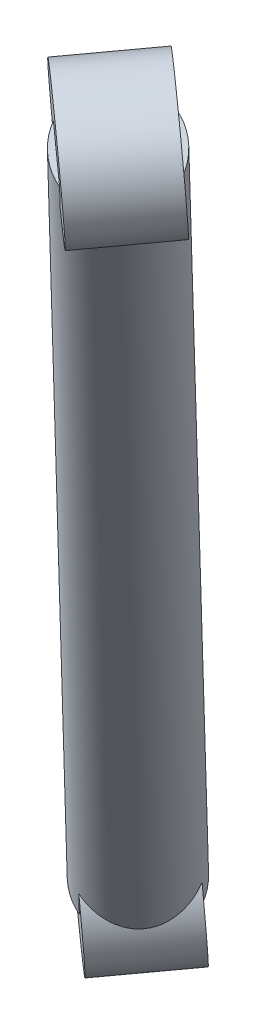
ISO-10303-21;
HEADER;
FILE_DESCRIPTION(('STEP AP214'),'2;1');
FILE_NAME('part.step','',(''),(''),'','','');
FILE_SCHEMA(('AUTOMOTIVE_DESIGN { 1 0 10303 214 1 1 1 1 }'));
ENDSEC;
DATA;
#1=APPLICATION_CONTEXT('core data for automotive mechanical design processes');
#2=APPLICATION_PROTOCOL_DEFINITION('international standard','automotive_design',2000,#1);
#3=PRODUCT_CONTEXT('',#1,'mechanical');
#4=PRODUCT('Part','Part','',(#3));
#5=PRODUCT_RELATED_PRODUCT_CATEGORY('part','',(#4));
#6=PRODUCT_DEFINITION_FORMATION('','',#4);
#7=PRODUCT_DEFINITION_CONTEXT('part definition',#1,'design');
#8=PRODUCT_DEFINITION('design','',#6,#7);
#9=PRODUCT_DEFINITION_SHAPE('','',#8);
#10=(LENGTH_UNIT() NAMED_UNIT(*) SI_UNIT(.MILLI.,.METRE.));
#11=(NAMED_UNIT(*) PLANE_ANGLE_UNIT() SI_UNIT($,.RADIAN.));
#12=(NAMED_UNIT(*) SI_UNIT($,.STERADIAN.) SOLID_ANGLE_UNIT());
#13=UNCERTAINTY_MEASURE_WITH_UNIT(LENGTH_MEASURE(1.E-05),#10,'distance_accuracy_value','');
#14=(GEOMETRIC_REPRESENTATION_CONTEXT(3) GLOBAL_UNCERTAINTY_ASSIGNED_CONTEXT((#13)) GLOBAL_UNIT_ASSIGNED_CONTEXT((#10,
#11,#12)) REPRESENTATION_CONTEXT('',''));
#15=CARTESIAN_POINT('',(0.,0.,0.));
#16=DIRECTION('',(0.,0.,1.));
#17=DIRECTION('',(1.,0.,0.));
#18=AXIS2_PLACEMENT_3D('',#15,#16,#17);
#19=CARTESIAN_POINT('',(503.54,1408.46,-83.29));
#20=DIRECTION('',(-0.463004376310124,-0.750306246149666,-0.47187655642813));
#21=DIRECTION('',(0.,0.532378141285444,-0.846506653654569));
#22=AXIS2_PLACEMENT_3D('',#19,#20,#21);
#23=CYLINDRICAL_SURFACE('',#22,7.99999999999995);
#24=CARTESIAN_POINT('',(501.092381544247,1403.73431411944,-95.1928170826298));
#25=CARTESIAN_POINT('',(500.926722161895,1403.92560452981,-95.1659029267145));
#26=CARTESIAN_POINT('',(500.761645688265,1404.11553220438,-95.1269638063124));
#27=CARTESIAN_POINT('',(500.432986995004,1404.49048769267,-95.0268332204544));
#28=CARTESIAN_POINT('',(500.269403625234,1404.67551953137,-94.9656606845747));
#29=CARTESIAN_POINT('',(499.943252009725,1405.03942709947,-94.822578618301));
#30=CARTESIAN_POINT('',(499.780688744562,1405.21828103168,-94.7406027939662));
#31=CARTESIAN_POINT('',(499.456864030324,1405.56729473088,-94.5576420583964));
#32=CARTESIAN_POINT('',(499.295602878749,1405.73745255584,-94.4566529244819));
#33=CARTESIAN_POINT('',(498.974409991023,1406.06651981513,-94.2374967253778));
#34=CARTESIAN_POINT('',(498.81447580295,1406.22545926307,-94.1193782954337));
#35=CARTESIAN_POINT('',(498.494795401074,1406.53033851225,-93.8671332232649));
#36=CARTESIAN_POINT('',(498.335049203294,1406.67627727475,-93.7330053039081));
#37=CARTESIAN_POINT('',(498.015133967541,1406.95224261934,-93.4502716062872));
#38=CARTESIAN_POINT('',(497.854965907378,1407.08229246804,-93.3016875838895));
#39=CARTESIAN_POINT('',(497.533224221479,1407.32338617471,-92.991434437252));
#40=CARTESIAN_POINT('',(497.371651285909,1407.43443886599,-92.8297714462599));
#41=CARTESIAN_POINT('',(496.987358998286,1407.66968526858,-92.4343831877809));
#42=CARTESIAN_POINT('',(496.763572730037,1407.78421012584,-92.1956717978335));
#43=CARTESIAN_POINT('',(496.424893892101,1407.91575536774,-91.8266637731422));
#44=CARTESIAN_POINT('',(496.311559255731,1407.95288812938,-91.7019036251233));
#45=CARTESIAN_POINT('',(496.084094101302,1408.01253361291,-91.4496824654047));
#46=CARTESIAN_POINT('',(495.969964018338,1408.03505377685,-91.3222228627185));
#47=CARTESIAN_POINT('',(495.740446942433,1408.06458574232,-91.0646431843398));
#48=CARTESIAN_POINT('',(495.625057552103,1408.07146316406,-90.9345096750827));
#49=CARTESIAN_POINT('',(495.394825738504,1408.0687472199,-90.6739211220134));
#50=CARTESIAN_POINT('',(495.279983304166,1408.0591541888,-90.5434660847909));
#51=CARTESIAN_POINT('',(495.05183501675,1408.02353019966,-90.2833892422512));
#52=CARTESIAN_POINT('',(494.938529705962,1407.99749358695,-90.1537677390692));
#53=CARTESIAN_POINT('',(494.714593397385,1407.92962913551,-89.8963822819624));
#54=CARTESIAN_POINT('',(494.603962422511,1407.88780116152,-89.7686183439585));
#55=CARTESIAN_POINT('',(494.397249712204,1407.79438497922,-89.5282074043766));
#56=CARTESIAN_POINT('',(494.300815331237,1407.74418136612,-89.4153207890385));
#57=CARTESIAN_POINT('',(494.111611343961,1407.63291720528,-89.1918234466123));
#58=CARTESIAN_POINT('',(494.018843070073,1407.57185275381,-89.0812135538554));
#59=CARTESIAN_POINT('',(493.746823164248,1407.37393472031,-88.7528174279853));
#60=CARTESIAN_POINT('',(493.573896952769,1407.22237541135,-88.5385113823091));
#61=CARTESIAN_POINT('',(493.283246339254,1406.92418883553,-88.1632424098674));
#62=CARTESIAN_POINT('',(493.161592144215,1406.78333091397,-88.0006045728299));
#63=CARTESIAN_POINT('',(492.932198989008,1406.48601657667,-87.6796497491821));
#64=CARTESIAN_POINT('',(492.82446636089,1406.32955311987,-87.5213347544016));
#65=CARTESIAN_POINT('',(492.62398204053,1406.00374614717,-87.2079799545906));
#66=CARTESIAN_POINT('',(492.53125354662,1405.83438327054,-87.052945537415));
#67=CARTESIAN_POINT('',(492.362084002123,1405.4854137624,-86.7455860804363));
#68=CARTESIAN_POINT('',(492.285641425253,1405.30580809282,-86.5932607879668));
#69=CARTESIAN_POINT('',(492.151491022501,1404.94190001874,-86.2935392779423));
#70=CARTESIAN_POINT('',(492.093457720835,1404.75774959513,-86.1461042457897));
#71=CARTESIAN_POINT('',(491.995416619475,1404.38346545752,-85.8529070223298));
#72=CARTESIAN_POINT('',(491.955405012855,1404.19333301626,-85.7071444840688));
#73=CARTESIAN_POINT('',(491.894761810267,1403.80932033464,-85.4174874165499));
#74=CARTESIAN_POINT('',(491.874081906469,1403.61545067853,-85.2735891218826));
#75=CARTESIAN_POINT('',(491.853246602271,1403.22524120921,-84.9873736964167));
#76=CARTESIAN_POINT('',(491.8531072078,1403.0288995889,-84.8450578850889));
#77=CARTESIAN_POINT('',(491.863914324977,1402.83234435317,-84.7036876880862));
#78=B_SPLINE_CURVE_WITH_KNOTS('',3,(#24,#25,#26,#27,#28,#29,#30,#31,#32,#33,#34,#35,#36,#37,#38,
#39,#40,#41,#42,#43,#44,#45,#46,#47,#48,#49,#50,#51,#52,#53,#54,#55,#56,#57,#58,#59,#60,#61,#62,
#63,#64,#65,#66,#67,#68,#69,#70,#71,#72,#73,#74,#75,#76,#77),.UNSPECIFIED.,.F.,.F.,(4,2,2,2,2,2,
2,2,2,2,2,2,2,2,2,2,2,2,2,2,2,2,2,2,2,2,4),(0.,0.762958906264792,1.5252697435942,
2.29004103323236,3.05498237225959,3.81779285757185,4.58066423562392,5.34240477719372,
6.10379015616985,7.13935621584758,7.65661504598396,8.17361023455535,8.69503018868906,
9.21643954399904,9.73802830137123,10.2596215265594,10.7293351342428,11.1992179147805,
12.1391755457859,12.8798105708365,13.6207812874998,14.3628869141442,15.1049229615161,
15.8329956148147,16.5609143969505,17.2870092879693,18.0136699761485),.UNSPECIFIED.);
#79=CARTESIAN_POINT('',(501.092381544247,1403.73431411944,-95.1928170826298));
#80=VERTEX_POINT('',#79);
#81=CARTESIAN_POINT('',(491.863914324977,1402.83234435317,-84.7036876880862));
#82=VERTEX_POINT('',#81);
#83=EDGE_CURVE('E235',#80,#82,#78,.T.);
#84=ORIENTED_EDGE('',*,*,#83,.F.);
#85=CARTESIAN_POINT('',(500.476936742047,1402.73681289455,-95.8201244470991));
#86=CARTESIAN_POINT('',(501.609324016441,1404.57216464494,-94.6659106585216));
#87=CARTESIAN_POINT('',(502.741711296524,1406.40751638902,-93.5116968654828));
#88=CARTESIAN_POINT('',(505.006485868069,1410.07821986454,-91.2032692704824));
#89=CARTESIAN_POINT('',(506.138873159531,1411.91357159598,-90.0490554685208));
#90=CARTESIAN_POINT('',(507.271260456682,1413.74892332111,-88.8948416620978));
#91=B_SPLINE_CURVE_WITH_KNOTS('',3,(#85,#86,#87,#88,#89,#90),.UNSPECIFIED.,.F.,.F.,(4,2,4),(0.,
7.33806773678093,14.676135473562),.UNSPECIFIED.);
#92=CARTESIAN_POINT('',(505.85874823777,1411.45955045955,-90.3345797355441));
#93=VERTEX_POINT('',#92);
#94=EDGE_CURVE('E145',#80,#93,#91,.T.);
#95=ORIENTED_EDGE('',*,*,#94,.T.);
#96=CARTESIAN_POINT('',(503.54,1408.46,-83.29));
#97=DIRECTION('',(-0.463004376310124,-0.750306246149666,-0.471876556428131));
#98=DIRECTION('',(0.,0.532378141285444,-0.846506653654569));
#99=AXIS2_PLACEMENT_3D('',#96,#97,#98);
#100=CIRCLE('',#99,7.99999999999995);
#101=CARTESIAN_POINT('',(510.449031802631,1406.36318224794,-86.735088513358));
#102=VERTEX_POINT('',#101);
#103=EDGE_CURVE('E133',#93,#102,#100,.T.);
#104=ORIENTED_EDGE('',*,*,#103,.T.);
#105=CARTESIAN_POINT('',(510.631047949373,1406.65811889125,-86.5495702153981));
#106=CARTESIAN_POINT('',(509.733743856513,1405.20413877994,-87.464139230562));
#107=CARTESIAN_POINT('',(508.836439760081,1403.75015867259,-88.3787082485261));
#108=CARTESIAN_POINT('',(507.041831560076,1400.84219846582,-90.2078462900548));
#109=CARTESIAN_POINT('',(506.144527456502,1399.38821836641,-91.1224153136194));
#110=CARTESIAN_POINT('',(505.247223349357,1397.93423827095,-92.0369843399844));
#111=B_SPLINE_CURVE_WITH_KNOTS('',3,(#105,#106,#107,#108,#109,#110),.UNSPECIFIED.,.F.,.F.,(4,2,
4),(0.,5.81384928802945,11.6276985760588),.UNSPECIFIED.);
#112=CARTESIAN_POINT('',(505.681977863056,1398.63870892363,-91.5938647674841));
#113=VERTEX_POINT('',#112);
#114=EDGE_CURVE('E241',#102,#113,#111,.T.);
#115=ORIENTED_EDGE('',*,*,#114,.T.);
#116=CARTESIAN_POINT('',(496.454885001525,1397.73521327492,-81.1036576642229));
#117=CARTESIAN_POINT('',(496.694218429472,1397.66329275144,-81.0555401041613));
#118=CARTESIAN_POINT('',(496.93752445823,1397.60012107376,-81.0148035451266));
#119=CARTESIAN_POINT('',(497.429598133899,1397.48995612207,-80.9484916849258));
#120=CARTESIAN_POINT('',(497.678360968739,1397.44294915873,-80.9229035417749));
#121=CARTESIAN_POINT('',(498.180090246445,1397.36354845983,-80.8871469892286));
#122=CARTESIAN_POINT('',(498.433067697512,1397.33120256415,-80.8770288079289));
#123=CARTESIAN_POINT('',(498.940540907341,1397.27978015917,-80.8729267251875));
#124=CARTESIAN_POINT('',(499.195036991056,1397.26070660063,-80.8789464101503));
#125=CARTESIAN_POINT('',(499.70295745764,1397.23422901296,-80.907901643129));
#126=CARTESIAN_POINT('',(499.956382851987,1397.22679265626,-80.9307900691646));
#127=CARTESIAN_POINT('',(500.461085147552,1397.22174716498,-80.9945739241513));
#128=CARTESIAN_POINT('',(500.71236187528,1397.22413881657,-81.0354707934248));
#129=CARTESIAN_POINT('',(501.210421248856,1397.23687376489,-81.1367528619069));
#130=CARTESIAN_POINT('',(501.457210024001,1397.24720522753,-81.1971089799538));
#131=CARTESIAN_POINT('',(501.944096602942,1397.27376042056,-81.3391583885887));
#132=CARTESIAN_POINT('',(502.184197476489,1397.28998139803,-81.4208417052305));
#133=CARTESIAN_POINT('',(502.73986845953,1397.33261918934,-81.6415915800772));
#134=CARTESIAN_POINT('',(503.051509133727,1397.36060455012,-81.7907302190088));
#135=CARTESIAN_POINT('',(503.49749905277,1397.40317231654,-82.0503057380667));
#136=CARTESIAN_POINT('',(503.642515772594,1397.41745247255,-82.1427529098801));
#137=CARTESIAN_POINT('',(503.924024765111,1397.44552980904,-82.3398422572722));
#138=CARTESIAN_POINT('',(504.060521343713,1397.45932723192,-82.4444781949853));
#139=CARTESIAN_POINT('',(504.324617686557,1397.48597887124,-82.6667511936401));
#140=CARTESIAN_POINT('',(504.452131415117,1397.49882401572,-82.7844917547321));
#141=CARTESIAN_POINT('',(504.695543908737,1397.52304787385,-83.0315697565457));
#142=CARTESIAN_POINT('',(504.811442908953,1397.53442661719,-83.1609069623757));
#143=CARTESIAN_POINT('',(505.030580423618,1397.55559239371,-83.4300818989983));
#144=CARTESIAN_POINT('',(505.133814546433,1397.56537887515,-83.569923245226));
#145=CARTESIAN_POINT('',(505.326975162902,1397.58350719594,-83.8585832154644));
#146=CARTESIAN_POINT('',(505.416901541146,1397.59184902276,-84.0074019173151));
#147=CARTESIAN_POINT('',(505.575075987204,1397.60670992016,-84.2972262819082));
#148=CARTESIAN_POINT('',(505.644590067601,1397.61332773916,-84.4375399296497));
#149=CARTESIAN_POINT('',(505.772987301721,1397.62613192298,-84.7229892672835));
#150=CARTESIAN_POINT('',(505.8318666174,1397.63231813153,-84.8681266757668));
#151=CARTESIAN_POINT('',(505.993184338899,1397.65095967916,-85.3093118446709));
#152=CARTESIAN_POINT('',(506.080272203239,1397.66349544636,-85.6110756022032));
#153=CARTESIAN_POINT('',(506.203045935756,1397.68977062221,-86.1574086022235));
#154=CARTESIAN_POINT('',(506.245715051785,1397.70269140558,-86.4005401147969));
#155=CARTESIAN_POINT('',(506.310377660375,1397.73318089802,-86.8893685331448));
#156=CARTESIAN_POINT('',(506.332361773274,1397.75075171104,-87.1350665516985));
#157=CARTESIAN_POINT('',(506.357391025022,1397.79236462857,-87.6272169529933));
#158=CARTESIAN_POINT('',(506.360407133911,1397.81641659366,-87.8736699147574));
#159=CARTESIAN_POINT('',(506.348832773637,1397.872632302,-88.3652064136952));
#160=CARTESIAN_POINT('',(506.334243956193,1397.90479528404,-88.6102900771713));
#161=CARTESIAN_POINT('',(506.288948537451,1397.97805565622,-89.0928327373697));
#162=CARTESIAN_POINT('',(506.258552185858,1398.01897244603,-89.3303482532556));
#163=CARTESIAN_POINT('',(506.182575939778,1398.11139334785,-89.8008085501176));
#164=CARTESIAN_POINT('',(506.136999258134,1398.16289521869,-90.0337542872281));
#165=CARTESIAN_POINT('',(506.03135603539,1398.27757046408,-90.4927929779347));
#166=CARTESIAN_POINT('',(505.971326009764,1398.34071433313,-90.7189016098869));
#167=CARTESIAN_POINT('',(505.837135338282,1398.47983213611,-91.1630188813855));
#168=CARTESIAN_POINT('',(505.7629637109,1398.55581603559,-91.3810210676833));
#169=CARTESIAN_POINT('',(505.681977863056,1398.63870892363,-91.5938647674841));
#170=B_SPLINE_CURVE_WITH_KNOTS('',3,(#116,#117,#118,#119,#120,#121,#122,#123,#124,#125,#126,
#127,#128,#129,#130,#131,#132,#133,#134,#135,#136,#137,#138,#139,#140,#141,#142,#143,#144,#145,
#146,#147,#148,#149,#150,#151,#152,#153,#154,#155,#156,#157,#158,#159,#160,#161,#162,#163,#164,
#165,#166,#167,#168,#169),.UNSPECIFIED.,.F.,.F.,(4,2,2,2,2,2,2,2,2,2,2,2,2,2,2,2,2,2,2,2,2,2,2,
2,2,2,4),(0.,0.763011542653548,1.52537531682672,2.2902091273305,3.05521292503414,
3.81808778439772,4.58102366988173,5.34282461898604,6.10426993796247,7.13968921486055,
7.65687484935751,8.17379695619204,8.69513827194005,9.2164690302268,9.73798005564087,
10.259495603565,10.7292144777064,11.1991025342617,12.1390705688162,12.8797587803774,
13.6207826970848,14.3629404532261,15.1050285845167,15.8330728947372,16.5609632156687,
17.2870335154304,18.0136699515927),.UNSPECIFIED.);
#171=CARTESIAN_POINT('',(496.454885001525,1397.73521327492,-81.1036576642229));
#172=VERTEX_POINT('',#171);
#173=EDGE_CURVE('E213',#172,#113,#170,.T.);
#174=ORIENTED_EDGE('',*,*,#173,.F.);
#175=CARTESIAN_POINT('',(501.230020040586,1405.47466099881,-76.2364829795065));
#176=CARTESIAN_POINT('',(500.361767520143,1404.06741387008,-77.1214708719438));
#177=CARTESIAN_POINT('',(499.493514996357,1402.66016674506,-78.0064587670028));
#178=CARTESIAN_POINT('',(497.757009942098,1399.84567250244,-79.7764345623642));
#179=CARTESIAN_POINT('',(496.888757411625,1398.43842538484,-80.6614224626666));
#180=CARTESIAN_POINT('',(496.020504877808,1397.03117827095,-81.5464103655907));
#181=B_SPLINE_CURVE_WITH_KNOTS('',3,(#175,#176,#177,#178,#179,#180),.UNSPECIFIED.,.F.,.F.,(4,2,
4),(0.,5.62642821095905,11.2528564219182),.UNSPECIFIED.);
#182=CARTESIAN_POINT('',(501.22125176223,1405.46044954045,-76.2454202644559));
#183=VERTEX_POINT('',#182);
#184=EDGE_CURVE('E220',#183,#172,#181,.T.);
#185=ORIENTED_EDGE('',*,*,#184,.F.);
#186=CARTESIAN_POINT('',(496.63096819737,1410.55681775206,-79.8449114866413));
#187=VERTEX_POINT('',#186);
#188=EDGE_CURVE('E209',#183,#187,#100,.T.);
#189=ORIENTED_EDGE('',*,*,#188,.T.);
#190=CARTESIAN_POINT('',(491.248775776375,1401.83558166783,-85.3306620470991));
#191=CARTESIAN_POINT('',(492.474135273463,1403.82113862483,-84.0817255479095));
#192=CARTESIAN_POINT('',(493.699494777207,1405.80669557443,-82.8327890434997));
#193=CARTESIAN_POINT('',(496.15021379801,1409.77780945886,-80.33491602424));
#194=CARTESIAN_POINT('',(497.375573315068,1411.76336639368,-79.0859795093901));
#195=CARTESIAN_POINT('',(498.600932838784,1413.74892332111,-77.83704298932));
#196=B_SPLINE_CURVE_WITH_KNOTS('',3,(#190,#191,#192,#193,#194,#195),.UNSPECIFIED.,.F.,.F.,(4,2,
4),(0.,7.93939936961963,15.8787987392393),.UNSPECIFIED.);
#197=EDGE_CURVE('E148',#82,#187,#196,.T.);
#198=ORIENTED_EDGE('',*,*,#197,.F.);
#199=EDGE_LOOP('',(#84,#95,#104,#115,#174,#185,#189,#198));
#200=FACE_BOUND('',#199,.T.);
#201=CARTESIAN_POINT('',(350.234985767874,1146.73305514412,-250.018811819599));
#202=CARTESIAN_POINT('',(350.24633386157,1146.52665615624,-249.870356328116));
#203=CARTESIAN_POINT('',(350.245612122436,1146.32049828583,-249.720869316441));
#204=CARTESIAN_POINT('',(350.221577078848,1145.91102268936,-249.420166559963));
#205=CARTESIAN_POINT('',(350.19828295431,1145.70770270071,-249.268952390532));
#206=CARTESIAN_POINT('',(350.130555733194,1145.3052520062,-248.964384258158));
#207=CARTESIAN_POINT('',(350.086054391371,1145.10613700786,-248.811024949699));
#208=CARTESIAN_POINT('',(349.977366374213,1144.71480759099,-248.502417806906));
#209=CARTESIAN_POINT('',(349.913175325937,1144.52259471598,-248.347169560417));
#210=CARTESIAN_POINT('',(349.766695889233,1144.14778189137,-248.034788692497));
#211=CARTESIAN_POINT('',(349.68445836122,1143.96515667847,-247.877662517447));
#212=CARTESIAN_POINT('',(349.503042130378,1143.61127336211,-247.560372411709));
#213=CARTESIAN_POINT('',(349.403862072865,1143.44001616912,-247.40020823902));
#214=CARTESIAN_POINT('',(349.189905643028,1143.11185553146,-247.076145537334));
#215=CARTESIAN_POINT('',(349.075152691153,1142.95493111322,-246.912252917972));
#216=CARTESIAN_POINT('',(348.831291987601,1142.65855610863,-246.579633641012));
#217=CARTESIAN_POINT('',(348.702190962159,1142.51909739918,-246.410909275798));
#218=CARTESIAN_POINT('',(348.381971202228,1142.21504961157,-246.005529257631));
#219=CARTESIAN_POINT('',(348.185251639975,1142.0594729749,-245.766274724977));
#220=CARTESIAN_POINT('',(347.876348888356,1141.86470406537,-245.399201710553));
#221=CARTESIAN_POINT('',(347.771134227042,1141.80623364401,-245.275543584022));
#222=CARTESIAN_POINT('',(347.556902298987,1141.70346190432,-245.025698642491));
#223=CARTESIAN_POINT('',(347.44788699715,1141.65915338143,-244.899513148068));
#224=CARTESIAN_POINT('',(347.226079530518,1141.58555051045,-244.644079159936));
#225=CARTESIAN_POINT('',(347.113263044603,1141.55638775805,-244.514813702895));
#226=CARTESIAN_POINT('',(346.885843650208,1141.51440758995,-244.255194668115));
#227=CARTESIAN_POINT('',(346.771240777951,1141.50158984327,-244.124841112464));
#228=CARTESIAN_POINT('',(346.541261319059,1141.49246139662,-243.864167965927));
#229=CARTESIAN_POINT('',(346.425884478589,1141.49615640606,-243.73384840237));
#230=CARTESIAN_POINT('',(346.195273955985,1141.51960693547,-243.474554977351));
#231=CARTESIAN_POINT('',(346.080040275099,1141.53936259472,-243.34558112757));
#232=CARTESIAN_POINT('',(345.861749759995,1141.59124567009,-243.102897065988));
#233=CARTESIAN_POINT('',(345.758620233784,1141.62194945332,-242.988943121658));
#234=CARTESIAN_POINT('',(345.553206081672,1141.69465342174,-242.763886947842));
#235=CARTESIAN_POINT('',(345.450921773465,1141.73665767166,-242.652785760265));
#236=CARTESIAN_POINT('',(345.145384666315,1141.87813591026,-242.324690874017));
#237=CARTESIAN_POINT('',(344.943490016413,1141.99306454127,-242.112953376048));
#238=CARTESIAN_POINT('',(344.585561810231,1142.22786994638,-241.75101780809));
#239=CARTESIAN_POINT('',(344.428879933182,1142.34153198637,-241.597289906956));
#240=CARTESIAN_POINT('',(344.116632817365,1142.58592352809,-241.302605978481));
#241=CARTESIAN_POINT('',(343.961068116881,1142.71666074202,-241.161655771367));
#242=CARTESIAN_POINT('',(343.650114040624,1142.99249624311,-240.893714594105));
#243=CARTESIAN_POINT('',(343.494725297323,1143.13761619803,-240.766745312942));
#244=CARTESIAN_POINT('',(343.18361700717,1143.43965932959,-240.528241854815));
#245=CARTESIAN_POINT('',(343.02789749272,1143.59658139765,-240.416706230936));
#246=CARTESIAN_POINT('',(342.718488204776,1143.91713239532,-240.212306914005));
#247=CARTESIAN_POINT('',(342.564815790262,1144.08057819504,-240.119129801745));
#248=CARTESIAN_POINT('',(342.256251689191,1144.41509371479,-239.950208645776));
#249=CARTESIAN_POINT('',(342.1013602674,1144.58616181498,-239.87446091895));
#250=CARTESIAN_POINT('',(341.790563097272,1144.93384005166,-239.74197591755));
#251=CARTESIAN_POINT('',(341.634660853549,1145.1104352613,-239.685191582723));
#252=CARTESIAN_POINT('',(341.321518585343,1145.4679694265,-239.591852512561));
#253=CARTESIAN_POINT('',(341.164277612543,1145.64891166164,-239.555313585302));
#254=CARTESIAN_POINT('',(341.00651833871,1145.83108584954,-239.529682969112));
#255=B_SPLINE_CURVE_WITH_KNOTS('',3,(#201,#202,#203,#204,#205,#206,#207,#208,#209,#210,#211,
#212,#213,#214,#215,#216,#217,#218,#219,#220,#221,#222,#223,#224,#225,#226,#227,#228,#229,#230,
#231,#232,#233,#234,#235,#236,#237,#238,#239,#240,#241,#242,#243,#244,#245,#246,#247,#248,#249,
#250,#251,#252,#253,#254),.UNSPECIFIED.,.F.,.F.,(4,2,2,2,2,2,2,2,2,2,2,2,2,2,2,2,2,2,2,2,2,2,2,
2,2,2,4),(0.,0.763011562492844,1.52537535667372,2.29020919167073,3.05521301383027,
3.81808789867547,4.58102380970383,5.34282478242508,6.10427012480448,7.1396893307186,
7.6568749298218,8.173797001317,8.69513827901055,9.21646899926276,9.73797998705923,
10.259495497392,10.7292143741119,11.19910243325,12.1390704729313,12.8797587148408,
13.6207826619457,14.3629404478308,15.1050286087034,15.8330727496986,16.5609629013794,
17.2870330329059,18.0136693005395),.UNSPECIFIED.);
#256=CARTESIAN_POINT('',(350.234985767874,1146.73305514412,-250.018811819599));
#257=VERTEX_POINT('',#256);
#258=CARTESIAN_POINT('',(341.00651833871,1145.83108584954,-239.529682969112));
#259=VERTEX_POINT('',#258);
#260=EDGE_CURVE('E12',#257,#259,#255,.T.);
#261=ORIENTED_EDGE('',*,*,#260,.F.);
#262=CARTESIAN_POINT('',(350.850124162137,1147.72981754499,-249.391837596946));
#263=CARTESIAN_POINT('',(349.624764703747,1145.74426071918,-250.640774098424));
#264=CARTESIAN_POINT('',(348.399405238695,1143.75870390076,-251.889710605127));
#265=CARTESIAN_POINT('',(345.948686295264,1139.78759027873,-254.387583628982));
#266=CARTESIAN_POINT('',(344.723326816886,1137.80203347511,-255.636520146134));
#267=CARTESIAN_POINT('',(343.497967331846,1135.81647667889,-256.885456668511));
#268=B_SPLINE_CURVE_WITH_KNOTS('',3,(#262,#263,#264,#265,#266,#267),.UNSPECIFIED.,.F.,.F.,(4,2,
4),(0.,7.93939902383895,15.8787980476781),.UNSPECIFIED.);
#269=CARTESIAN_POINT('',(345.467931885541,1139.00858199562,-254.877588193515));
#270=VERTEX_POINT('',#269);
#271=EDGE_CURVE('E192',#257,#270,#268,.T.);
#272=ORIENTED_EDGE('',*,*,#271,.T.);
#273=CARTESIAN_POINT('',(338.5589,1141.1054,-251.4325));
#274=DIRECTION('',(-0.463004376310124,-0.750306246149666,-0.471876556428131));
#275=DIRECTION('',(0.,0.532378141285444,-0.846506653654569));
#276=AXIS2_PLACEMENT_3D('',#273,#274,#275);
#277=CIRCLE('',#276,7.99999999999995);
#278=CARTESIAN_POINT('',(340.877648067476,1144.10495057025,-258.477079744463));
#279=VERTEX_POINT('',#278);
#280=EDGE_CURVE('E132',#279,#270,#277,.T.);
#281=ORIENTED_EDGE('',*,*,#280,.F.);
#282=CARTESIAN_POINT('',(340.868879798288,1144.09073912575,-258.486017020493));
#283=CARTESIAN_POINT('',(341.737132244538,1145.49798623356,-257.60102916138));
#284=CARTESIAN_POINT('',(342.605384694134,1146.90523333766,-256.716041299642));
#285=CARTESIAN_POINT('',(344.341889600019,1149.71972753844,-254.946065570919));
#286=CARTESIAN_POINT('',(345.210142056308,1151.12697463511,-254.061077703933));
#287=CARTESIAN_POINT('',(346.078394515942,1152.53422172806,-253.176089834324));
#288=B_SPLINE_CURVE_WITH_KNOTS('',3,(#282,#283,#284,#285,#286,#287),.UNSPECIFIED.,.F.,.F.,(4,2,
4),(0.,5.62642801365886,11.2528560273176),.UNSPECIFIED.);
#289=CARTESIAN_POINT('',(345.644014540901,1151.83018691538,-253.618842405312));
#290=VERTEX_POINT('',#289);
#291=EDGE_CURVE('E186',#279,#290,#288,.T.);
#292=ORIENTED_EDGE('',*,*,#291,.T.);
#293=CARTESIAN_POINT('',(336.416922064033,1150.92669107823,-243.128635379842));
#294=CARTESIAN_POINT('',(336.331885808548,1151.0137358254,-243.352133636197));
#295=CARTESIAN_POINT('',(336.254361527676,1151.09315595386,-243.581309218197));
#296=CARTESIAN_POINT('',(336.114944700099,1151.23788192149,-244.048483307365));
#297=CARTESIAN_POINT('',(336.053038931495,1151.30319969225,-244.286474154855));
#298=CARTESIAN_POINT('',(335.945146762724,1151.42118980125,-244.769913586793));
#299=CARTESIAN_POINT('',(335.899212389198,1151.47382064435,-245.015383762727));
#300=CARTESIAN_POINT('',(335.824205179686,1151.56761060928,-245.511090326936));
#301=CARTESIAN_POINT('',(335.795136095188,1151.60876717773,-245.761327762857));
#302=CARTESIAN_POINT('',(335.754834494379,1151.68104964754,-246.263951474719));
#303=CARTESIAN_POINT('',(335.743552517325,1151.71220317139,-246.516329822965));
#304=CARTESIAN_POINT('',(335.73988626008,1151.76631997512,-247.02212861781));
#305=CARTESIAN_POINT('',(335.747503488504,1151.78928260101,-247.275549145989));
#306=CARTESIAN_POINT('',(335.783245767255,1151.82882065669,-247.781118333401));
#307=CARTESIAN_POINT('',(335.811340401229,1151.84540550405,-248.033268321129));
#308=CARTESIAN_POINT('',(335.889975453001,1151.87422126037,-248.534154617569));
#309=CARTESIAN_POINT('',(335.940505399314,1151.88645419576,-248.782892463098));
#310=CARTESIAN_POINT('',(336.089206587308,1151.91277312628,-249.363020529801));
#311=CARTESIAN_POINT('',(336.197981225466,1151.92594008588,-249.691918799806));
#312=CARTESIAN_POINT('',(336.399442173099,1151.94674119279,-250.168526840926));
#313=CARTESIAN_POINT('',(336.472932042039,1151.95384613859,-250.324531439572));
#314=CARTESIAN_POINT('',(336.633036781411,1151.96898764862,-250.629573566135));
#315=CARTESIAN_POINT('',(336.719644943073,1151.97702373617,-250.778614604569));
#316=CARTESIAN_POINT('',(336.906793951631,1151.99453097755,-251.069417388471));
#317=CARTESIAN_POINT('',(337.007447699038,1152.00401382493,-251.211105915985));
#318=CARTESIAN_POINT('',(337.221613274313,1152.02456733567,-251.484292877642));
#319=CARTESIAN_POINT('',(337.335124840776,1152.03563796675,-251.615791518858));
#320=CARTESIAN_POINT('',(337.574049882856,1152.0592970541,-251.867417717136));
#321=CARTESIAN_POINT('',(337.699467440142,1152.07188603131,-251.987541346164));
#322=CARTESIAN_POINT('',(337.960797384111,1152.09823415398,-252.21560441322));
#323=CARTESIAN_POINT('',(338.096709860681,1152.11199330947,-252.323543746871));
#324=CARTESIAN_POINT('',(338.363489541784,1152.13872006345,-252.516852901177));
#325=CARTESIAN_POINT('',(338.493513980948,1152.15163027334,-252.603399722339));
#326=CARTESIAN_POINT('',(338.759684758978,1152.17744195975,-252.766543212084));
#327=CARTESIAN_POINT('',(338.89583328585,1152.19034343145,-252.843136285777));
#328=CARTESIAN_POINT('',(339.311999345604,1152.22822301755,-253.058499561598));
#329=CARTESIAN_POINT('',(339.59968483844,1152.25237069001,-253.182816604695));
#330=CARTESIAN_POINT('',(340.125400357796,1152.28957615956,-253.373758385146));
#331=CARTESIAN_POINT('',(340.361023636696,1152.30389976389,-253.447026859143));
#332=CARTESIAN_POINT('',(340.837912269675,1152.32643193781,-253.573907004817));
#333=CARTESIAN_POINT('',(341.079180132611,1152.33463773283,-253.627509752026));
#334=CARTESIAN_POINT('',(341.565496823796,1152.34309895666,-253.716727828161));
#335=CARTESIAN_POINT('',(341.810550877165,1152.34334218901,-253.75231548086));
#336=CARTESIAN_POINT('',(342.302306930667,1152.3341596183,-253.806717292778));
#337=CARTESIAN_POINT('',(342.549008774135,1152.3247347218,-253.825533024357));
#338=CARTESIAN_POINT('',(343.03778389259,1152.29492019879,-253.847173941513));
#339=CARTESIAN_POINT('',(343.27985690711,1152.27474024293,-253.850293372638));
#340=CARTESIAN_POINT('',(343.762382163473,1152.22215025637,-253.841995559703));
#341=CARTESIAN_POINT('',(344.002834737039,1152.18974281128,-253.830581387692));
#342=CARTESIAN_POINT('',(344.479865242817,1152.1114608725,-253.793726437948));
#343=CARTESIAN_POINT('',(344.716451373831,1152.06562032565,-253.768320877303));
#344=CARTESIAN_POINT('',(345.18457003158,1151.95923281424,-253.703797026418));
#345=CARTESIAN_POINT('',(345.416098476725,1151.8986744178,-253.664668066198));
#346=CARTESIAN_POINT('',(345.644014540901,1151.83018691538,-253.618842405312));
#347=B_SPLINE_CURVE_WITH_KNOTS('',3,(#293,#294,#295,#296,#297,#298,#299,#300,#301,#302,#303,
#304,#305,#306,#307,#308,#309,#310,#311,#312,#313,#314,#315,#316,#317,#318,#319,#320,#321,#322,
#323,#324,#325,#326,#327,#328,#329,#330,#331,#332,#333,#334,#335,#336,#337,#338,#339,#340,#341,
#342,#343,#344,#345,#346),.UNSPECIFIED.,.F.,.F.,(4,2,2,2,2,2,2,2,2,2,2,2,2,2,2,2,2,2,2,2,2,2,2,
2,2,2,4),(0.,0.762958903337787,1.52526973777842,2.29004102486494,3.0549823613305,
3.81779284427717,4.58066421996895,5.34240475902519,6.10379013547657,7.13935618763489,
7.65661501402481,8.1736101988551,8.69503014893603,9.21643950019535,9.73802825356006,
10.2596214747429,10.7293350827112,11.1992178635342,12.139175495135,12.8798105275254,
13.620781251572,14.3628868854091,15.1049229398325,15.8329954362103,16.5609140614511,
17.2870087949184,18.013669325106),.UNSPECIFIED.);
#348=CARTESIAN_POINT('',(336.416922064033,1150.92669107823,-243.128635379842));
#349=VERTEX_POINT('',#348);
#350=EDGE_CURVE('E75',#349,#290,#347,.T.);
#351=ORIENTED_EDGE('',*,*,#350,.F.);
#352=CARTESIAN_POINT('',(331.467852050627,1142.90728150559,-248.172930026138));
#353=CARTESIAN_POINT('',(332.36515613354,1144.36126155061,-247.258360990557));
#354=CARTESIAN_POINT('',(333.262460220026,1145.81524159165,-246.343791952174));
#355=CARTESIAN_POINT('',(335.057068400148,1148.72320166581,-244.514653869803));
#356=CARTESIAN_POINT('',(335.954372493784,1150.17718169892,-243.600084825814));
#357=CARTESIAN_POINT('',(336.851676590993,1151.63116172806,-242.685515779023));
#358=B_SPLINE_CURVE_WITH_KNOTS('',3,(#352,#353,#354,#355,#356,#357),.UNSPECIFIED.,.F.,.F.,(4,2,
4),(0.,5.81384915389521,11.6276983077905),.UNSPECIFIED.);
#359=CARTESIAN_POINT('',(331.64986811446,1143.20221800438,-247.987411806485));
#360=VERTEX_POINT('',#359);
#361=EDGE_CURVE('E136',#360,#349,#358,.T.);
#362=ORIENTED_EDGE('',*,*,#361,.F.);
#363=CARTESIAN_POINT('',(336.240151932525,1138.10584942975,-244.387920255536));
#364=VERTEX_POINT('',#363);
#365=EDGE_CURVE('E127',#364,#360,#277,.T.);
#366=ORIENTED_EDGE('',*,*,#365,.F.);
#367=CARTESIAN_POINT('',(341.621963119042,1146.82858710942,-238.902375596946));
#368=CARTESIAN_POINT('',(340.489575924192,1144.99323535836,-240.056589359618));
#369=CARTESIAN_POINT('',(339.357188723648,1143.15788361361,-241.210803126755));
#370=CARTESIAN_POINT('',(337.092414311171,1139.48718013677,-243.519230669959));
#371=CARTESIAN_POINT('',(335.960027099239,1137.65182840467,-244.673444446027));
#372=CARTESIAN_POINT('',(334.827639881612,1135.81647667889,-245.827658226559));
#373=B_SPLINE_CURVE_WITH_KNOTS('',3,(#367,#368,#369,#370,#371,#372),.UNSPECIFIED.,.F.,.F.,(4,2,
4),(0.,7.33806759114755,14.676135182295),.UNSPECIFIED.);
#374=EDGE_CURVE('E82',#259,#364,#373,.T.);
#375=ORIENTED_EDGE('',*,*,#374,.F.);
#376=EDGE_LOOP('',(#261,#272,#281,#292,#351,#362,#366,#375));
#377=FACE_BOUND('',#376,.T.);
#378=ADVANCED_FACE('F61',(#200,#377),#23,.T.);
#379=CARTESIAN_POINT('',(338.5589,1141.1054,-251.4325));
#380=DIRECTION('',(-0.463004376310124,-0.750306246149666,-0.471876556428131));
#381=DIRECTION('',(0.,0.532378141285444,-0.846506653654569));
#382=AXIS2_PLACEMENT_3D('',#379,#380,#381);
#383=PLANE('',#382);
#384=ORIENTED_EDGE('',*,*,#280,.T.);
#385=DIRECTION('',(-0.592603005788633,0.657938257334944,-0.464692292883511));
#386=VECTOR('',#385,1.);
#387=CARTESIAN_POINT('',(343.172789976508,1141.55676628293,-256.677333968989));
#388=LINE('',#387,#386);
#389=EDGE_CURVE('E144',#270,#279,#388,.T.);
#390=ORIENTED_EDGE('',*,*,#389,.T.);
#391=EDGE_LOOP('',(#384,#390));
#392=FACE_BOUND('',#391,.T.);
#393=ADVANCED_FACE('F266',(#392),#383,.T.);
#394=CARTESIAN_POINT('',(503.54,1408.46,-83.29));
#395=DIRECTION('',(-0.463004376310124,-0.750306246149666,-0.471876556428131));
#396=DIRECTION('',(0.,0.532378141285444,-0.846506653654569));
#397=AXIS2_PLACEMENT_3D('',#394,#395,#396);
#398=PLANE('',#397);
#399=DIRECTION('',(-0.592603014539807,0.657938256478836,-0.464692282935624));
#400=VECTOR('',#399,1.);
#401=CARTESIAN_POINT('',(508.1538900202,1408.91136635374,-88.5348341244511));
#402=LINE('',#401,#400);
#403=EDGE_CURVE('E206',#102,#93,#402,.T.);
#404=ORIENTED_EDGE('',*,*,#403,.F.);
#405=ORIENTED_EDGE('',*,*,#103,.F.);
#406=EDGE_LOOP('',(#404,#405));
#407=FACE_BOUND('',#406,.T.);
#408=ADVANCED_FACE('F264',(#407),#398,.F.);
#409=ORIENTED_EDGE('',*,*,#188,.F.);
#410=DIRECTION('',(-0.592603014539807,0.657938256478836,-0.464692282935624));
#411=VECTOR('',#410,1.);
#412=CARTESIAN_POINT('',(498.9261099798,1408.00863364626,-78.0451658755486));
#413=LINE('',#412,#411);
#414=EDGE_CURVE('E204',#183,#187,#413,.T.);
#415=ORIENTED_EDGE('',*,*,#414,.T.);
#416=EDGE_LOOP('',(#409,#415));
#417=FACE_BOUND('',#416,.T.);
#418=ADVANCED_FACE('F63',(#417),#398,.F.);
#419=DIRECTION('',(-0.592603005788633,0.657938257334944,-0.464692292883511));
#420=VECTOR('',#419,1.);
#421=CARTESIAN_POINT('',(333.945010023492,1140.65403371707,-246.187666031011));
#422=LINE('',#421,#420);
#423=EDGE_CURVE('E131',#364,#360,#422,.T.);
#424=ORIENTED_EDGE('',*,*,#423,.F.);
#425=ORIENTED_EDGE('',*,*,#365,.T.);
#426=EDGE_LOOP('',(#424,#425));
#427=FACE_BOUND('',#426,.T.);
#428=ADVANCED_FACE('F129',(#427),#383,.T.);
#429=CARTESIAN_POINT('',(508.153991,1408.91153,-88.5347311999999));
#430=DIRECTION('',(-0.659141587239672,-0.0645042872615728,0.749247332258209));
#431=DIRECTION('',(0.750810948680657,0.,0.660517160519886));
#432=AXIS2_PLACEMENT_3D('',#429,#430,#431);
#433=PLANE('',#432);
#434=ORIENTED_EDGE('',*,*,#94,.F.);
#435=CARTESIAN_POINT('',(508.153991,1408.91153,-88.5347311999999));
#436=DIRECTION('',(-0.659141587239672,-0.0645042872615728,0.749247332258209));
#437=DIRECTION('',(0.750810948680657,0.,0.660517160519886));
#438=AXIS2_PLACEMENT_3D('',#435,#436,#437);
#439=CIRCLE('',#438,11.);
#440=EDGE_CURVE('E198',#113,#80,#439,.T.);
#441=ORIENTED_EDGE('',*,*,#440,.F.);
#442=ORIENTED_EDGE('',*,*,#114,.F.);
#443=ORIENTED_EDGE('',*,*,#403,.T.);
#444=EDGE_LOOP('',(#434,#441,#442,#443));
#445=FACE_BOUND('',#444,.T.);
#446=ADVANCED_FACE('F166',(#445),#433,.F.);
#447=CARTESIAN_POINT('',(498.926009,1408.00847,-78.0452688));
#448=DIRECTION('',(-0.659141587239672,-0.0645042872615728,0.749247332258209));
#449=DIRECTION('',(0.750810948680657,0.,0.660517160519886));
#450=AXIS2_PLACEMENT_3D('',#447,#448,#449);
#451=PLANE('',#450);
#452=ORIENTED_EDGE('',*,*,#414,.F.);
#453=ORIENTED_EDGE('',*,*,#184,.T.);
#454=CARTESIAN_POINT('',(498.926009,1408.00847,-78.0452688));
#455=DIRECTION('',(-0.659141587239672,-0.0645042872615728,0.749247332258209));
#456=DIRECTION('',(0.750810948680657,0.,0.660517160519886));
#457=AXIS2_PLACEMENT_3D('',#454,#455,#456);
#458=CIRCLE('',#457,11.);
#459=EDGE_CURVE('E201',#172,#82,#458,.T.);
#460=ORIENTED_EDGE('',*,*,#459,.T.);
#461=ORIENTED_EDGE('',*,*,#197,.T.);
#462=EDGE_LOOP('',(#452,#453,#460,#461));
#463=FACE_BOUND('',#462,.T.);
#464=ADVANCED_FACE('F230',(#463),#451,.T.);
#465=CARTESIAN_POINT('',(508.153991,1408.91153,-88.5347311999999));
#466=DIRECTION('',(-0.659141587239668,-0.0645042872615729,0.749247332258212));
#467=DIRECTION('',(0.75081094868066,0.,0.660517160519882));
#468=AXIS2_PLACEMENT_3D('',#465,#466,#467);
#469=CYLINDRICAL_SURFACE('',#468,11.);
#470=ORIENTED_EDGE('',*,*,#440,.T.);
#471=ORIENTED_EDGE('',*,*,#83,.T.);
#472=ORIENTED_EDGE('',*,*,#459,.F.);
#473=ORIENTED_EDGE('',*,*,#173,.T.);
#474=EDGE_LOOP('',(#470,#471,#472,#473));
#475=FACE_BOUND('',#474,.T.);
#476=ADVANCED_FACE('F227',(#475),#469,.T.);
#477=CARTESIAN_POINT('',(343.172891,1141.55693,-256.677231));
#478=DIRECTION('',(-0.65914160134995,-0.0645042886424206,0.749247319725976));
#479=DIRECTION('',(0.750810936189425,0.,0.66051717471869));
#480=AXIS2_PLACEMENT_3D('',#477,#478,#479);
#481=PLANE('',#480);
#482=ORIENTED_EDGE('',*,*,#271,.F.);
#483=CARTESIAN_POINT('',(343.172891,1141.55693,-256.677231));
#484=DIRECTION('',(-0.65914160134995,-0.0645042886424206,0.749247319725976));
#485=DIRECTION('',(0.750810936189425,0.,0.66051717471869));
#486=AXIS2_PLACEMENT_3D('',#483,#484,#485);
#487=CIRCLE('',#486,11.);
#488=EDGE_CURVE('E391',#290,#257,#487,.T.);
#489=ORIENTED_EDGE('',*,*,#488,.F.);
#490=ORIENTED_EDGE('',*,*,#291,.F.);
#491=ORIENTED_EDGE('',*,*,#389,.F.);
#492=EDGE_LOOP('',(#482,#489,#490,#491));
#493=FACE_BOUND('',#492,.T.);
#494=ADVANCED_FACE('F171',(#493),#481,.F.);
#495=CARTESIAN_POINT('',(333.944909,1140.65387,-246.187769));
#496=DIRECTION('',(-0.65914160134995,-0.0645042886424206,0.749247319725976));
#497=DIRECTION('',(0.750810936189425,0.,0.66051717471869));
#498=AXIS2_PLACEMENT_3D('',#495,#496,#497);
#499=PLANE('',#498);
#500=CARTESIAN_POINT('',(333.944909,1140.65387,-246.187769));
#501=DIRECTION('',(-0.65914160134995,-0.0645042886424206,0.749247319725976));
#502=DIRECTION('',(0.750810936189425,0.,0.66051717471869));
#503=AXIS2_PLACEMENT_3D('',#500,#501,#502);
#504=CIRCLE('',#503,11.);
#505=EDGE_CURVE('E141',#349,#259,#504,.T.);
#506=ORIENTED_EDGE('',*,*,#505,.T.);
#507=ORIENTED_EDGE('',*,*,#374,.T.);
#508=ORIENTED_EDGE('',*,*,#423,.T.);
#509=ORIENTED_EDGE('',*,*,#361,.T.);
#510=EDGE_LOOP('',(#506,#507,#508,#509));
#511=FACE_BOUND('',#510,.T.);
#512=ADVANCED_FACE('F143',(#511),#499,.T.);
#513=CARTESIAN_POINT('',(343.172891,1141.55693,-256.677231));
#514=DIRECTION('',(-0.659141601349954,-0.0645042886424207,0.749247319725972));
#515=DIRECTION('',(0.750810936189421,0.,0.660517174718694));
#516=AXIS2_PLACEMENT_3D('',#513,#514,#515);
#517=CYLINDRICAL_SURFACE('',#516,11.);
#518=ORIENTED_EDGE('',*,*,#488,.T.);
#519=ORIENTED_EDGE('',*,*,#260,.T.);
#520=ORIENTED_EDGE('',*,*,#505,.F.);
#521=ORIENTED_EDGE('',*,*,#350,.T.);
#522=EDGE_LOOP('',(#518,#519,#520,#521));
#523=FACE_BOUND('',#522,.T.);
#524=ADVANCED_FACE('F161',(#523),#517,.T.);
#525=CLOSED_SHELL('',(#378,#393,#408,#418,#428,#446,#464,#476,#494,#512,#524));
#526=MANIFOLD_SOLID_BREP('B2',#525);
#527=ADVANCED_BREP_SHAPE_REPRESENTATION('',(#18,#526),#14);
#528=SHAPE_DEFINITION_REPRESENTATION(#9,#527);
ENDSEC;
END-ISO-10303-21;
